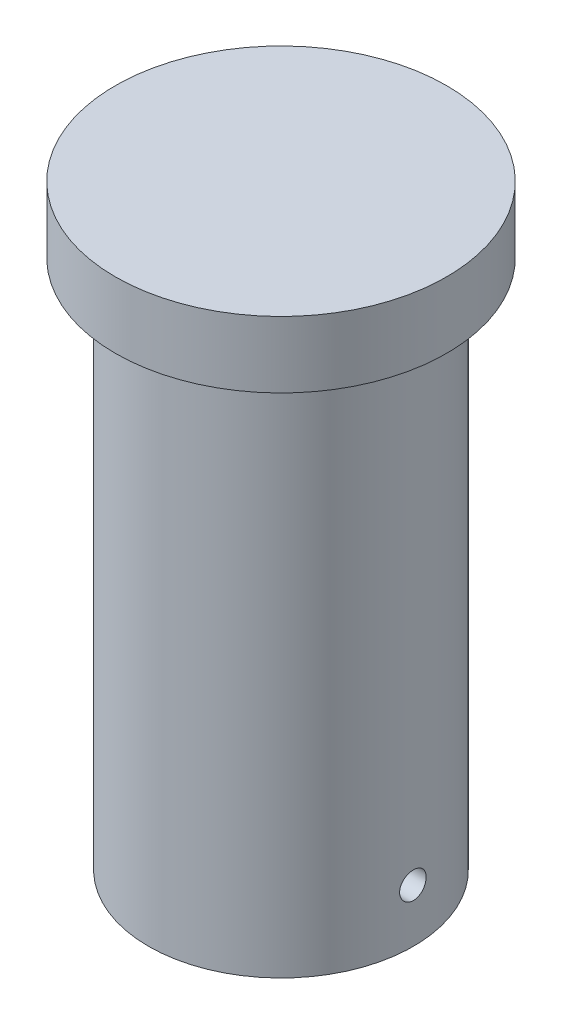
ISO-10303-21;
HEADER;
FILE_DESCRIPTION(('STEP AP214'),'2;1');
FILE_NAME('part.step','',(''),(''),'','','');
FILE_SCHEMA(('AUTOMOTIVE_DESIGN { 1 0 10303 214 1 1 1 1 }'));
ENDSEC;
DATA;
#1=APPLICATION_CONTEXT('core data for automotive mechanical design processes');
#2=APPLICATION_PROTOCOL_DEFINITION('international standard','automotive_design',2000,#1);
#3=PRODUCT_CONTEXT('',#1,'mechanical');
#4=PRODUCT('Part','Part','',(#3));
#5=PRODUCT_RELATED_PRODUCT_CATEGORY('part','',(#4));
#6=PRODUCT_DEFINITION_FORMATION('','',#4);
#7=PRODUCT_DEFINITION_CONTEXT('part definition',#1,'design');
#8=PRODUCT_DEFINITION('design','',#6,#7);
#9=PRODUCT_DEFINITION_SHAPE('','',#8);
#10=(LENGTH_UNIT() NAMED_UNIT(*) SI_UNIT(.MILLI.,.METRE.));
#11=(NAMED_UNIT(*) PLANE_ANGLE_UNIT() SI_UNIT($,.RADIAN.));
#12=(NAMED_UNIT(*) SI_UNIT($,.STERADIAN.) SOLID_ANGLE_UNIT());
#13=UNCERTAINTY_MEASURE_WITH_UNIT(LENGTH_MEASURE(1.E-05),#10,'distance_accuracy_value','');
#14=(GEOMETRIC_REPRESENTATION_CONTEXT(3) GLOBAL_UNCERTAINTY_ASSIGNED_CONTEXT((#13)) GLOBAL_UNIT_ASSIGNED_CONTEXT((#10,
#11,#12)) REPRESENTATION_CONTEXT('',''));
#15=CARTESIAN_POINT('',(0.,0.,0.));
#16=DIRECTION('',(0.,0.,1.));
#17=DIRECTION('',(1.,0.,0.));
#18=AXIS2_PLACEMENT_3D('',#15,#16,#17);
#19=CARTESIAN_POINT('',(0.,20.,0.));
#20=DIRECTION('',(0.,-1.,0.));
#21=DIRECTION('',(0.,0.,-1.));
#22=AXIS2_PLACEMENT_3D('',#19,#20,#21);
#23=CYLINDRICAL_SURFACE('',#22,5.);
#24=CARTESIAN_POINT('',(-4.9749371855331,2.,-0.5));
#25=CARTESIAN_POINT('',(-4.97493751398451,2.0280097820868,-0.499998786696756));
#26=CARTESIAN_POINT('',(-4.97517628497109,2.05603808420592,-0.497638429491237));
#27=CARTESIAN_POINT('',(-4.97610543779059,2.11131759314677,-0.488258157381781));
#28=CARTESIAN_POINT('',(-4.97679631730609,2.13856790901874,-0.481233107443218));
#29=CARTESIAN_POINT('',(-4.97855066523694,2.19148290960895,-0.462730058034463));
#30=CARTESIAN_POINT('',(-4.97961390773395,2.21714854469572,-0.451254758146949));
#31=CARTESIAN_POINT('',(-4.9819929028591,2.26618389614587,-0.424182133695551));
#32=CARTESIAN_POINT('',(-4.98330860532164,2.28955406724186,-0.408585627812963));
#33=CARTESIAN_POINT('',(-4.98604963354949,2.33342563182875,-0.373652380999352));
#34=CARTESIAN_POINT('',(-4.98747530002633,2.35391750475189,-0.35430370905413));
#35=CARTESIAN_POINT('',(-4.99027252617859,2.39136880450178,-0.312440857659782));
#36=CARTESIAN_POINT('',(-4.99164408337606,2.40832806970316,-0.289926533453284));
#37=CARTESIAN_POINT('',(-4.99418191577802,2.43826562850358,-0.242313180825494));
#38=CARTESIAN_POINT('',(-4.99534775447323,2.45123549939683,-0.217208831264785));
#39=CARTESIAN_POINT('',(-4.99733908437885,2.47277221657434,-0.165164992143755));
#40=CARTESIAN_POINT('',(-4.99816458388532,2.48133917018473,-0.13822554733411));
#41=CARTESIAN_POINT('',(-4.99937983285513,2.49379895467662,-0.083372391371475));
#42=CARTESIAN_POINT('',(-4.99977103921408,2.49770741637497,-0.055462263515791));
#43=CARTESIAN_POINT('',(-5.00007857799346,2.50078763456686,0.00062037034447123));
#44=CARTESIAN_POINT('',(-4.99999492272636,2.49995951387314,0.0287928695272303));
#45=CARTESIAN_POINT('',(-4.99936335655593,2.49360276367492,0.0844944220322797));
#46=CARTESIAN_POINT('',(-4.99881710575856,2.48809094221805,0.112025414967489));
#47=CARTESIAN_POINT('',(-4.99732364632465,2.47254943552669,0.165769589752266));
#48=CARTESIAN_POINT('',(-4.99637643247976,2.46251969160621,0.191982754478864));
#49=CARTESIAN_POINT('',(-4.99418468741958,2.43820861837278,0.242400157339793));
#50=CARTESIAN_POINT('',(-4.99293963682879,2.42391985123492,0.266600785490825));
#51=CARTESIAN_POINT('',(-4.99029192259704,2.39150173833182,0.312266756587097));
#52=CARTESIAN_POINT('',(-4.98888925433405,2.37337227992741,0.333732019280414));
#53=CARTESIAN_POINT('',(-4.98607646733926,2.33369288524318,0.373416385911344));
#54=CARTESIAN_POINT('',(-4.98466634286514,2.31212832762921,0.391620873095172));
#55=CARTESIAN_POINT('',(-4.98200369964111,2.26624156739461,0.424153767678959));
#56=CARTESIAN_POINT('',(-4.98075118111982,2.24191936077393,0.438482169456445));
#57=CARTESIAN_POINT('',(-4.97854544757075,2.1911964874001,0.462856092286615));
#58=CARTESIAN_POINT('',(-4.97759229566277,2.16479538378856,0.47290071028648));
#59=CARTESIAN_POINT('',(-4.97609450935469,2.11066969769266,0.488410367818794));
#60=CARTESIAN_POINT('',(-4.97554986250884,2.08294515555628,0.493875546871517));
#61=CARTESIAN_POINT('',(-4.97493290263708,2.02708791023525,0.50005238769598));
#62=CARTESIAN_POINT('',(-4.97485855773802,1.99895748986758,0.500784498323606));
#63=CARTESIAN_POINT('',(-4.97518525677386,1.94297436708857,0.497528123435681));
#64=CARTESIAN_POINT('',(-4.9755862942853,1.91512166092982,0.493539701704877));
#65=CARTESIAN_POINT('',(-4.97681672211201,1.86054420886083,0.48097258725376));
#66=CARTESIAN_POINT('',(-4.97764521000673,1.83381721445267,0.472403563594454));
#67=CARTESIAN_POINT('',(-4.97963645519397,1.78217997413485,0.45092835983797));
#68=CARTESIAN_POINT('',(-4.98079922014335,1.75726976985641,0.438022080391794));
#69=CARTESIAN_POINT('',(-4.98333292177857,1.70988001298561,0.408187500711609));
#70=CARTESIAN_POINT('',(-4.98470455407336,1.68740902901687,0.391245649920345));
#71=CARTESIAN_POINT('',(-4.98749916312593,1.64562247336297,0.353840266725587));
#72=CARTESIAN_POINT('',(-4.98892214115433,1.62630697982996,0.333376647124067));
#73=CARTESIAN_POINT('',(-4.99166523924651,1.59130918330095,0.289419902113237));
#74=CARTESIAN_POINT('',(-4.99298497027737,1.57564022020689,0.265916127984726));
#75=CARTESIAN_POINT('',(-4.99536721053315,1.54847206574679,0.216598858708566));
#76=CARTESIAN_POINT('',(-4.99642972328246,1.53697281724645,0.190785395214813));
#77=CARTESIAN_POINT('',(-4.99817605207003,1.51849311617233,0.137628063216408));
#78=CARTESIAN_POINT('',(-4.99886054302824,1.51150460633739,0.11028701882498));
#79=CARTESIAN_POINT('',(-4.99977647306824,1.50221846521008,0.0548124069918399));
#80=CARTESIAN_POINT('',(-5.00000792488281,1.49992070208298,0.0266788618461092));
#81=CARTESIAN_POINT('',(-4.99999169156635,1.50008313321997,-0.0294511120378729));
#82=CARTESIAN_POINT('',(-4.99974609188335,1.50252261841833,-0.0574476036122636));
#83=CARTESIAN_POINT('',(-4.99880746788795,1.51204687282849,-0.112630944178181));
#84=CARTESIAN_POINT('',(-4.99811444322437,1.51913164568648,-0.139817792534182));
#85=CARTESIAN_POINT('',(-4.99635861906981,1.53773962869647,-0.192609954383871));
#86=CARTESIAN_POINT('',(-4.99529587001624,1.54926223346708,-0.218215483038764));
#87=CARTESIAN_POINT('',(-4.99291906208148,1.57641658445849,-0.267132300077398));
#88=CARTESIAN_POINT('',(-4.99160500467077,1.59204830663556,-0.290443601884279));
#89=CARTESIAN_POINT('',(-4.98886592334527,1.62705480951188,-0.334216362213469));
#90=CARTESIAN_POINT('',(-4.9874404573035,1.6464450081224,-0.35466546310967));
#91=CARTESIAN_POINT('',(-4.98464295384829,1.68838767577272,-0.392028879696571));
#92=CARTESIAN_POINT('',(-4.98327092933888,1.71094090258454,-0.408942345923924));
#93=CARTESIAN_POINT('',(-4.980731917053,1.75863217095996,-0.438788320212026));
#94=CARTESIAN_POINT('',(-4.97956545962653,1.78377664066203,-0.451710593997417));
#95=CARTESIAN_POINT('',(-4.97757597381231,1.83587414562312,-0.473132354049384));
#96=CARTESIAN_POINT('',(-4.97675255826679,1.86282510196286,-0.481636828944929));
#97=CARTESIAN_POINT('',(-4.97575003769072,1.90827387044956,-0.491860844166765));
#98=CARTESIAN_POINT('',(-4.97544665967847,1.92648112565321,-0.494908856199112));
#99=CARTESIAN_POINT('',(-4.97504012588832,1.96312291152128,-0.498978829302557));
#100=CARTESIAN_POINT('',(-4.97493696926992,1.9815574412313,-0.500000798878632));
#101=CARTESIAN_POINT('',(-4.9749371855331,2.,-0.5));
#102=B_SPLINE_CURVE_WITH_KNOTS('',3,(#24,#25,#26,#27,#28,#29,#30,#31,#32,#33,#34,#35,#36,#37,
#38,#39,#40,#41,#42,#43,#44,#45,#46,#47,#48,#49,#50,#51,#52,#53,#54,#55,#56,#57,#58,#59,#60,#61,
#62,#63,#64,#65,#66,#67,#68,#69,#70,#71,#72,#73,#74,#75,#76,#77,#78,#79,#80,#81,#82,#83,#84,#85,
#86,#87,#88,#89,#90,#91,#92,#93,#94,#95,#96,#97,#98,#99,#100,#101),.UNSPECIFIED.,.T.,.F.,(4,2,2,
2,2,2,2,2,2,2,2,2,2,2,2,2,2,2,2,2,2,2,2,2,2,2,2,2,2,2,2,2,2,2,2,2,2,2,4),(0.,0.0839619972182312,
0.168016575910885,0.252020245498737,0.336007240210656,0.420265807649625,0.504528229276264,
0.588967349856458,0.673404412038973,0.757557354492247,0.841708114991161,0.925558159093307,
1.00940929240487,1.09340772733207,1.17740862609264,1.26177712542501,1.34614574713781,
1.43053214558967,1.51491597297516,1.59893498153883,1.68295285483435,1.76679407352263,
1.85063721280524,1.93476594905859,2.01889676861601,2.10333068409059,2.18776344259002,
2.27204496347181,2.35632411556575,2.44023566734241,2.52414728498329,2.60804745997623,
2.69194714405399,2.77619857518994,2.86047022517262,2.94495620535238,3.02934657447,
3.08463013803023,3.13991346951908),.UNSPECIFIED.);
#103=CARTESIAN_POINT('',(-4.9749371855331,2.,-0.5));
#104=VERTEX_POINT('',#103);
#105=EDGE_CURVE('E35',#104,#104,#102,.T.);
#106=ORIENTED_EDGE('',*,*,#105,.T.);
#107=EDGE_LOOP('',(#106));
#108=FACE_BOUND('',#107,.T.);
#109=CARTESIAN_POINT('',(4.9749371855331,2.,-0.5));
#110=CARTESIAN_POINT('',(4.97493751398451,1.9719902179132,-0.499998786696756));
#111=CARTESIAN_POINT('',(4.97517628497109,1.94396191579408,-0.497638429491238));
#112=CARTESIAN_POINT('',(4.97610543779059,1.88868240685323,-0.488258157381781));
#113=CARTESIAN_POINT('',(4.97679631730609,1.86143209098125,-0.481233107443218));
#114=CARTESIAN_POINT('',(4.97855066523694,1.80851709039105,-0.462730058034463));
#115=CARTESIAN_POINT('',(4.97961390773395,1.78285145530428,-0.451254758146949));
#116=CARTESIAN_POINT('',(4.9819929028591,1.73381610385413,-0.42418213369555));
#117=CARTESIAN_POINT('',(4.98330860532164,1.71044593275814,-0.408585627812963));
#118=CARTESIAN_POINT('',(4.98604963354949,1.66657436817125,-0.373652380999352));
#119=CARTESIAN_POINT('',(4.98747530002633,1.64608249524811,-0.35430370905413));
#120=CARTESIAN_POINT('',(4.99027252617859,1.60863119549822,-0.312440857659782));
#121=CARTESIAN_POINT('',(4.99164408337606,1.59167193029684,-0.289926533453284));
#122=CARTESIAN_POINT('',(4.99418191577802,1.56173437149642,-0.242313180825494));
#123=CARTESIAN_POINT('',(4.99534775447323,1.54876450060317,-0.217208831264785));
#124=CARTESIAN_POINT('',(4.99733908437885,1.52722778342566,-0.165164992143755));
#125=CARTESIAN_POINT('',(4.99816458388532,1.51866082981527,-0.138225547334109));
#126=CARTESIAN_POINT('',(4.99937983285513,1.50620104532338,-0.0833723913714748));
#127=CARTESIAN_POINT('',(4.99977103921408,1.50229258362503,-0.0554622635157908));
#128=CARTESIAN_POINT('',(5.00007857799346,1.49921236543314,0.000620370344471531));
#129=CARTESIAN_POINT('',(4.99999492272636,1.50004048612686,0.0287928695272306));
#130=CARTESIAN_POINT('',(4.99936335655593,1.50639723632508,0.08449442203228));
#131=CARTESIAN_POINT('',(4.99881710575856,1.51190905778195,0.112025414967489));
#132=CARTESIAN_POINT('',(4.99732364632465,1.52745056447331,0.165769589752266));
#133=CARTESIAN_POINT('',(4.99637643247976,1.53748030839379,0.191982754478864));
#134=CARTESIAN_POINT('',(4.99418468741958,1.56179138162722,0.242400157339793));
#135=CARTESIAN_POINT('',(4.99293963682879,1.57608014876508,0.266600785490825));
#136=CARTESIAN_POINT('',(4.99029192259704,1.60849826166818,0.312266756587097));
#137=CARTESIAN_POINT('',(4.98888925433405,1.62662772007259,0.333732019280414));
#138=CARTESIAN_POINT('',(4.98607646733926,1.66630711475682,0.373416385911344));
#139=CARTESIAN_POINT('',(4.98466634286514,1.68787167237079,0.391620873095172));
#140=CARTESIAN_POINT('',(4.98200369964111,1.73375843260539,0.424153767678959));
#141=CARTESIAN_POINT('',(4.98075118111982,1.75808063922607,0.438482169456445));
#142=CARTESIAN_POINT('',(4.97854544757075,1.8088035125999,0.462856092286615));
#143=CARTESIAN_POINT('',(4.97759229566277,1.83520461621144,0.47290071028648));
#144=CARTESIAN_POINT('',(4.97609450935469,1.88933030230734,0.488410367818794));
#145=CARTESIAN_POINT('',(4.97554986250884,1.91705484444372,0.493875546871517));
#146=CARTESIAN_POINT('',(4.97493290263708,1.97291208976475,0.50005238769598));
#147=CARTESIAN_POINT('',(4.97485855773802,2.00104251013242,0.500784498323606));
#148=CARTESIAN_POINT('',(4.97518525677386,2.05702563291143,0.497528123435681));
#149=CARTESIAN_POINT('',(4.9755862942853,2.08487833907018,0.493539701704877));
#150=CARTESIAN_POINT('',(4.97681672211201,2.13945579113917,0.48097258725376));
#151=CARTESIAN_POINT('',(4.97764521000673,2.16618278554733,0.472403563594454));
#152=CARTESIAN_POINT('',(4.97963645519397,2.21782002586515,0.45092835983797));
#153=CARTESIAN_POINT('',(4.98079922014335,2.24273023014359,0.438022080391794));
#154=CARTESIAN_POINT('',(4.98333292177857,2.29011998701439,0.408187500711609));
#155=CARTESIAN_POINT('',(4.98470455407336,2.31259097098313,0.391245649920345));
#156=CARTESIAN_POINT('',(4.98749916312593,2.35437752663703,0.353840266725587));
#157=CARTESIAN_POINT('',(4.98892214115433,2.37369302017004,0.333376647124067));
#158=CARTESIAN_POINT('',(4.99166523924651,2.40869081669905,0.289419902113237));
#159=CARTESIAN_POINT('',(4.99298497027737,2.42435977979311,0.265916127984726));
#160=CARTESIAN_POINT('',(4.99536721053315,2.45152793425321,0.216598858708566));
#161=CARTESIAN_POINT('',(4.99642972328246,2.46302718275355,0.190785395214813));
#162=CARTESIAN_POINT('',(4.99817605207003,2.48150688382767,0.137628063216407));
#163=CARTESIAN_POINT('',(4.99886054302824,2.48849539366261,0.11028701882498));
#164=CARTESIAN_POINT('',(4.99977647306824,2.49778153478992,0.0548124069918394));
#165=CARTESIAN_POINT('',(5.00000792488281,2.50007929791702,0.0266788618461087));
#166=CARTESIAN_POINT('',(4.99999169156635,2.49991686678003,-0.0294511120378733));
#167=CARTESIAN_POINT('',(4.99974609188335,2.49747738158167,-0.057447603612264));
#168=CARTESIAN_POINT('',(4.99880746788795,2.48795312717151,-0.112630944178181));
#169=CARTESIAN_POINT('',(4.99811444322437,2.48086835431352,-0.139817792534183));
#170=CARTESIAN_POINT('',(4.99635861906981,2.46226037130353,-0.192609954383872));
#171=CARTESIAN_POINT('',(4.99529587001624,2.45073776653292,-0.218215483038764));
#172=CARTESIAN_POINT('',(4.99291906208148,2.42358341554151,-0.267132300077398));
#173=CARTESIAN_POINT('',(4.99160500467077,2.40795169336444,-0.290443601884279));
#174=CARTESIAN_POINT('',(4.98886592334527,2.37294519048812,-0.334216362213469));
#175=CARTESIAN_POINT('',(4.9874404573035,2.3535549918776,-0.35466546310967));
#176=CARTESIAN_POINT('',(4.98464295384829,2.31161232422728,-0.392028879696571));
#177=CARTESIAN_POINT('',(4.98327092933888,2.28905909741546,-0.408942345923924));
#178=CARTESIAN_POINT('',(4.980731917053,2.24136782904004,-0.438788320212026));
#179=CARTESIAN_POINT('',(4.97956545962653,2.21622335933797,-0.451710593997417));
#180=CARTESIAN_POINT('',(4.97757597381231,2.16412585437688,-0.473132354049384));
#181=CARTESIAN_POINT('',(4.97675255826679,2.13717489803714,-0.481636828944929));
#182=CARTESIAN_POINT('',(4.97575003769072,2.09172612955044,-0.491860844166765));
#183=CARTESIAN_POINT('',(4.97544665967847,2.07351887434679,-0.494908856199112));
#184=CARTESIAN_POINT('',(4.97504012588832,2.03687708847872,-0.498978829302557));
#185=CARTESIAN_POINT('',(4.97493696926992,2.0184425587687,-0.500000798878632));
#186=CARTESIAN_POINT('',(4.9749371855331,2.,-0.5));
#187=B_SPLINE_CURVE_WITH_KNOTS('',3,(#109,#110,#111,#112,#113,#114,#115,#116,#117,#118,#119,
#120,#121,#122,#123,#124,#125,#126,#127,#128,#129,#130,#131,#132,#133,#134,#135,#136,#137,#138,
#139,#140,#141,#142,#143,#144,#145,#146,#147,#148,#149,#150,#151,#152,#153,#154,#155,#156,#157,
#158,#159,#160,#161,#162,#163,#164,#165,#166,#167,#168,#169,#170,#171,#172,#173,#174,#175,#176,
#177,#178,#179,#180,#181,#182,#183,#184,#185,#186),.UNSPECIFIED.,.T.,.F.,(4,2,2,2,2,2,2,2,2,2,2,
2,2,2,2,2,2,2,2,2,2,2,2,2,2,2,2,2,2,2,2,2,2,2,2,2,2,2,4),(0.,0.083961997218231,
0.168016575910885,0.252020245498737,0.336007240210657,0.420265807649625,0.504528229276264,
0.588967349856458,0.673404412038973,0.757557354492248,0.841708114991161,0.925558159093308,
1.00940929240487,1.09340772733207,1.17740862609264,1.26177712542501,1.34614574713781,
1.43053214558967,1.51491597297516,1.59893498153883,1.68295285483435,1.76679407352264,
1.85063721280524,1.93476594905859,2.01889676861601,2.10333068409059,2.18776344259002,
2.27204496347181,2.35632411556575,2.44023566734241,2.52414728498329,2.60804745997623,
2.69194714405399,2.77619857518994,2.86047022517262,2.94495620535238,3.02934657447,
3.08463013803023,3.13991346951908),.UNSPECIFIED.);
#188=CARTESIAN_POINT('',(4.9749371855331,2.,-0.5));
#189=VERTEX_POINT('',#188);
#190=EDGE_CURVE('E52',#189,#189,#187,.T.);
#191=ORIENTED_EDGE('',*,*,#190,.T.);
#192=EDGE_LOOP('',(#191));
#193=FACE_BOUND('',#192,.T.);
#194=CARTESIAN_POINT('',(0.,20.,0.));
#195=DIRECTION('',(0.,1.,0.));
#196=DIRECTION('',(0.,0.,1.));
#197=AXIS2_PLACEMENT_3D('',#194,#195,#196);
#198=CIRCLE('',#197,5.);
#199=CARTESIAN_POINT('',(0.,20.,5.));
#200=VERTEX_POINT('',#199);
#201=EDGE_CURVE('E10',#200,#200,#198,.T.);
#202=ORIENTED_EDGE('',*,*,#201,.F.);
#203=EDGE_LOOP('',(#202));
#204=FACE_BOUND('',#203,.T.);
#205=CARTESIAN_POINT('',(0.,0.,0.));
#206=DIRECTION('',(0.,1.,0.));
#207=DIRECTION('',(0.,0.,1.));
#208=AXIS2_PLACEMENT_3D('',#205,#206,#207);
#209=CIRCLE('',#208,5.);
#210=CARTESIAN_POINT('',(0.,0.,5.));
#211=VERTEX_POINT('',#210);
#212=EDGE_CURVE('E42',#211,#211,#209,.T.);
#213=ORIENTED_EDGE('',*,*,#212,.T.);
#214=EDGE_LOOP('',(#213));
#215=FACE_BOUND('',#214,.T.);
#216=ADVANCED_FACE('F31',(#108,#193,#204,#215),#23,.T.);
#217=CARTESIAN_POINT('',(0.,0.,0.));
#218=DIRECTION('',(0.,1.,0.));
#219=DIRECTION('',(0.,0.,1.));
#220=AXIS2_PLACEMENT_3D('',#217,#218,#219);
#221=PLANE('',#220);
#222=ORIENTED_EDGE('',*,*,#212,.F.);
#223=EDGE_LOOP('',(#222));
#224=FACE_BOUND('',#223,.T.);
#225=ADVANCED_FACE('F71',(#224),#221,.F.);
#226=CARTESIAN_POINT('',(0.,22.5,0.));
#227=DIRECTION('',(0.,-1.,0.));
#228=DIRECTION('',(0.,0.,-1.));
#229=AXIS2_PLACEMENT_3D('',#226,#227,#228);
#230=CYLINDRICAL_SURFACE('',#229,6.25);
#231=CARTESIAN_POINT('',(0.,22.5,0.));
#232=DIRECTION('',(0.,1.,0.));
#233=DIRECTION('',(0.,0.,1.));
#234=AXIS2_PLACEMENT_3D('',#231,#232,#233);
#235=CIRCLE('',#234,6.25);
#236=CARTESIAN_POINT('',(0.,22.5,6.25));
#237=VERTEX_POINT('',#236);
#238=EDGE_CURVE('E47',#237,#237,#235,.T.);
#239=ORIENTED_EDGE('',*,*,#238,.F.);
#240=EDGE_LOOP('',(#239));
#241=FACE_BOUND('',#240,.T.);
#242=CARTESIAN_POINT('',(0.,20.,0.));
#243=DIRECTION('',(0.,1.,0.));
#244=DIRECTION('',(0.,0.,1.));
#245=AXIS2_PLACEMENT_3D('',#242,#243,#244);
#246=CIRCLE('',#245,6.25);
#247=CARTESIAN_POINT('',(0.,20.,6.25));
#248=VERTEX_POINT('',#247);
#249=EDGE_CURVE('E50',#248,#248,#246,.T.);
#250=ORIENTED_EDGE('',*,*,#249,.T.);
#251=EDGE_LOOP('',(#250));
#252=FACE_BOUND('',#251,.T.);
#253=ADVANCED_FACE('F66',(#241,#252),#230,.T.);
#254=CARTESIAN_POINT('',(0.,22.5,0.));
#255=DIRECTION('',(0.,1.,0.));
#256=DIRECTION('',(0.,0.,1.));
#257=AXIS2_PLACEMENT_3D('',#254,#255,#256);
#258=PLANE('',#257);
#259=ORIENTED_EDGE('',*,*,#238,.T.);
#260=EDGE_LOOP('',(#259));
#261=FACE_BOUND('',#260,.T.);
#262=ADVANCED_FACE('F62',(#261),#258,.T.);
#263=CARTESIAN_POINT('',(0.,20.,0.));
#264=DIRECTION('',(0.,1.,0.));
#265=DIRECTION('',(0.,0.,1.));
#266=AXIS2_PLACEMENT_3D('',#263,#264,#265);
#267=PLANE('',#266);
#268=ORIENTED_EDGE('',*,*,#201,.T.);
#269=EDGE_LOOP('',(#268));
#270=FACE_BOUND('',#269,.T.);
#271=ORIENTED_EDGE('',*,*,#249,.F.);
#272=EDGE_LOOP('',(#271));
#273=FACE_BOUND('',#272,.T.);
#274=ADVANCED_FACE('F60',(#270,#273),#267,.F.);
#275=CARTESIAN_POINT('',(-6.25,2.,0.));
#276=DIRECTION('',(1.,0.,0.));
#277=DIRECTION('',(0.,0.,-1.));
#278=AXIS2_PLACEMENT_3D('',#275,#276,#277);
#279=CYLINDRICAL_SURFACE('',#278,0.5);
#280=ORIENTED_EDGE('',*,*,#190,.F.);
#281=EDGE_LOOP('',(#280));
#282=FACE_BOUND('',#281,.T.);
#283=ORIENTED_EDGE('',*,*,#105,.F.);
#284=EDGE_LOOP('',(#283));
#285=FACE_BOUND('',#284,.T.);
#286=ADVANCED_FACE('F56',(#282,#285),#279,.F.);
#287=CLOSED_SHELL('',(#216,#225,#253,#262,#274,#286));
#288=MANIFOLD_SOLID_BREP('B2',#287);
#289=ADVANCED_BREP_SHAPE_REPRESENTATION('',(#18,#288),#14);
#290=SHAPE_DEFINITION_REPRESENTATION(#9,#289);
ENDSEC;
END-ISO-10303-21;
